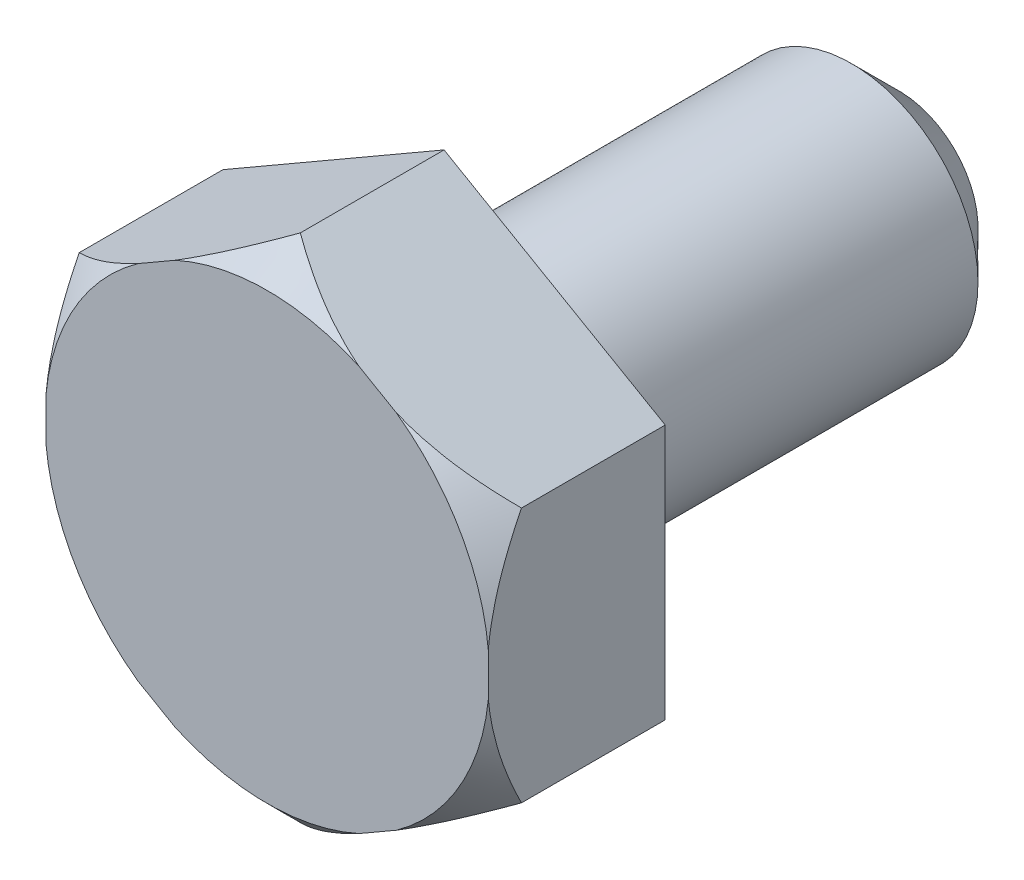
ISO-10303-21;
HEADER;
FILE_DESCRIPTION(('STEP AP214'),'2;1');
FILE_NAME('part.step','',(''),(''),'','','');
FILE_SCHEMA(('AUTOMOTIVE_DESIGN { 1 0 10303 214 1 1 1 1 }'));
ENDSEC;
DATA;
#1=APPLICATION_CONTEXT('core data for automotive mechanical design processes');
#2=APPLICATION_PROTOCOL_DEFINITION('international standard','automotive_design',2000,#1);
#3=PRODUCT_CONTEXT('',#1,'mechanical');
#4=PRODUCT('Part','Part','',(#3));
#5=PRODUCT_RELATED_PRODUCT_CATEGORY('part','',(#4));
#6=PRODUCT_DEFINITION_FORMATION('','',#4);
#7=PRODUCT_DEFINITION_CONTEXT('part definition',#1,'design');
#8=PRODUCT_DEFINITION('design','',#6,#7);
#9=PRODUCT_DEFINITION_SHAPE('','',#8);
#10=(LENGTH_UNIT() NAMED_UNIT(*) SI_UNIT(.MILLI.,.METRE.));
#11=(NAMED_UNIT(*) PLANE_ANGLE_UNIT() SI_UNIT($,.RADIAN.));
#12=(NAMED_UNIT(*) SI_UNIT($,.STERADIAN.) SOLID_ANGLE_UNIT());
#13=UNCERTAINTY_MEASURE_WITH_UNIT(LENGTH_MEASURE(1.E-05),#10,'distance_accuracy_value','');
#14=(GEOMETRIC_REPRESENTATION_CONTEXT(3) GLOBAL_UNCERTAINTY_ASSIGNED_CONTEXT((#13)) GLOBAL_UNIT_ASSIGNED_CONTEXT((#10,
#11,#12)) REPRESENTATION_CONTEXT('',''));
#15=CARTESIAN_POINT('',(0.,0.,0.));
#16=DIRECTION('',(0.,0.,1.));
#17=DIRECTION('',(1.,0.,0.));
#18=AXIS2_PLACEMENT_3D('',#15,#16,#17);
#19=CARTESIAN_POINT('',(3.5,2.02072594216369,2.8));
#20=DIRECTION('',(-0.5,-0.866025403784439,0.));
#21=DIRECTION('',(0.866025403784439,-0.5,0.));
#22=AXIS2_PLACEMENT_3D('',#19,#20,#21);
#23=PLANE('',#22);
#24=CARTESIAN_POINT('',(5.9454453864592,0.608847390002945,0.339913087692459));
#25=CARTESIAN_POINT('',(5.86253355712437,0.656716556988413,0.417507902960893));
#26=CARTESIAN_POINT('',(5.77929317667569,0.704775413047905,0.494638864110166));
#27=CARTESIAN_POINT('',(5.61204157732736,0.801338168954062,0.647795567213771));
#28=CARTESIAN_POINT('',(5.52803028979062,0.849842108428362,0.723821209168573));
#29=CARTESIAN_POINT('',(5.35893878090904,0.947467136598823,0.874753577786142));
#30=CARTESIAN_POINT('',(5.27385650528265,0.996589411334988,0.949657241459688));
#31=CARTESIAN_POINT('',(5.10268934375333,1.09541281812036,1.09791813904846));
#32=CARTESIAN_POINT('',(5.01660448486452,1.14511393457297,1.17127541448137));
#33=CARTESIAN_POINT('',(4.8408874884927,1.24656418972943,1.31814431061563));
#34=CARTESIAN_POINT('',(4.75122298625936,1.2983320142306,1.39160442675106));
#35=CARTESIAN_POINT('',(4.57047965672409,1.40268422419202,1.53616519114766));
#36=CARTESIAN_POINT('',(4.47940088323365,1.45526857858419,1.60726592885927));
#37=CARTESIAN_POINT('',(4.29567630148132,1.56134201531565,1.74652586332209));
#38=CARTESIAN_POINT('',(4.20303188550136,1.61483029382059,1.81468749999745));
#39=CARTESIAN_POINT('',(4.01585530132248,1.72289674508226,1.94744807331912));
#40=CARTESIAN_POINT('',(3.92132337276294,1.77747477948313,2.01204745836192));
#41=CARTESIAN_POINT('',(3.72756834413303,1.88933929741945,2.13845900293608));
#42=CARTESIAN_POINT('',(3.6282872421778,1.94665926835874,2.2001534177239));
#43=CARTESIAN_POINT('',(3.42711221948829,2.06280772186276,2.3176725874829));
#44=CARTESIAN_POINT('',(3.32521792819775,2.12163641836824,2.37349650421528));
#45=CARTESIAN_POINT('',(3.11914858474324,2.24061060928343,2.47743717172208));
#46=CARTESIAN_POINT('',(3.01498881650609,2.30074727951388,2.52559390618238));
#47=CARTESIAN_POINT('',(2.80380698340774,2.42267316770117,2.61270611917105));
#48=CARTESIAN_POINT('',(2.69678579554812,2.48446187932091,2.65166438176945));
#49=CARTESIAN_POINT('',(2.50137060521279,2.59728489206476,2.7118226004194));
#50=CARTESIAN_POINT('',(2.41343726761734,2.64805322819623,2.73500659242414));
#51=CARTESIAN_POINT('',(2.23623185162629,2.75036282282053,2.77312919578989));
#52=CARTESIAN_POINT('',(2.14695996966461,2.80190396790217,2.78806900506808));
#53=CARTESIAN_POINT('',(1.96777845837467,2.90535446167922,2.80893602489146));
#54=CARTESIAN_POINT('',(1.87787024257386,2.95726299427418,2.81487918820381));
#55=CARTESIAN_POINT('',(1.69795041756462,3.06113975367581,2.81747709971623));
#56=CARTESIAN_POINT('',(1.6079388073351,3.11310798107202,2.81413175538349));
#57=CARTESIAN_POINT('',(1.4287608471379,3.21655642462471,2.79835918825703));
#58=CARTESIAN_POINT('',(1.33959290258016,3.26803756141821,2.78595573147838));
#59=CARTESIAN_POINT('',(1.16243690874153,3.3703186221495,2.75273025141026));
#60=CARTESIAN_POINT('',(1.07444914417603,3.42111838170679,2.73190623312342));
#61=CARTESIAN_POINT('',(0.899817031987229,3.52194227868814,2.68270008111317));
#62=CARTESIAN_POINT('',(0.813177424181728,3.57196367957713,2.6542957881744));
#63=CARTESIAN_POINT('',(0.641717245262521,3.67095626003144,2.59100974097743));
#64=CARTESIAN_POINT('',(0.556896589382002,3.7199274885369,2.55612828930277));
#65=CARTESIAN_POINT('',(0.359385719898484,3.83396044220108,2.46758436700233));
#66=CARTESIAN_POINT('',(0.247463881106022,3.89857854595611,2.4116455046732));
#67=CARTESIAN_POINT('',(0.0267799028337228,4.02599050021746,2.2919452918341));
#68=CARTESIAN_POINT('',(-0.081980529611628,4.08878336516696,2.22817980885716));
#69=CARTESIAN_POINT('',(-0.296873342818029,4.21285178871859,2.09444860650389));
#70=CARTESIAN_POINT('',(-0.402999800696974,4.27412392774314,2.02447029350188));
#71=CARTESIAN_POINT('',(-0.612760035829428,4.39522905596214,1.87977669426378));
#72=CARTESIAN_POINT('',(-0.716394246490776,4.45506229538473,1.80506223999207));
#73=CARTESIAN_POINT('',(-0.92203200338347,4.57378730968228,1.65153695750505));
#74=CARTESIAN_POINT('',(-1.02402579514843,4.63267345281345,1.57270878721689));
#75=CARTESIAN_POINT('',(-1.22621704715098,4.7494086265849,1.41203158125712));
#76=CARTESIAN_POINT('',(-1.32641435655378,4.80725757014069,1.33018229367729));
#77=CARTESIAN_POINT('',(-1.62451526984676,4.97936621267606,1.08119553551893));
#78=CARTESIAN_POINT('',(-1.82015662470169,5.09231980156618,0.910444515892401));
#79=CARTESIAN_POINT('',(-2.08630228986086,5.24597907298948,0.671078723283172));
#80=CARTESIAN_POINT('',(-2.15870272344146,5.28777948280668,0.605227857205958));
#81=CARTESIAN_POINT('',(-2.30263042333883,5.37087617908628,0.473004386203389));
#82=CARTESIAN_POINT('',(-2.37416012123807,5.41217386942346,0.406635311835265));
#83=CARTESIAN_POINT('',(-2.4454453864592,5.45333043648813,0.339913087692462));
#84=B_SPLINE_CURVE_WITH_KNOTS('',3,(#24,#25,#26,#27,#28,#29,#30,#31,#32,#33,#34,#35,#36,#37,#38,
#39,#40,#41,#42,#43,#44,#45,#46,#47,#48,#49,#50,#51,#52,#53,#54,#55,#56,#57,#58,#59,#60,#61,#62,
#63,#64,#65,#66,#67,#68,#69,#70,#71,#72,#73,#74,#75,#76,#77,#78,#79,#80,#81,#82,#83),
.UNSPECIFIED.,.F.,.F.,(4,2,2,2,2,2,2,2,2,2,2,2,2,2,2,2,2,2,2,2,2,2,2,2,2,2,2,2,2,4),(0.,
0.3697065164903,0.739446275196128,1.11005834868063,1.48066045920368,1.86148013092087,
2.24228534819872,2.62276809806816,3.00320284503721,3.39362813267329,3.78410909301732,
4.17248185108359,4.56073691057943,4.87288952996369,5.18499678020368,5.49654995388696,
5.80810623129737,6.11884799356529,6.42966341987057,6.74139759086865,7.05311720271868,
7.47523215545123,7.89757095207291,8.32078629277429,8.74392749515359,9.16902504618888,
9.59415812333966,10.4434751115574,10.762737361846,11.0806064703738),.UNSPECIFIED.);
#85=CARTESIAN_POINT('',(3.5,2.02072594216369,2.275));
#86=VERTEX_POINT('',#85);
#87=CARTESIAN_POINT('',(2.04423696418394,2.8612111227684,2.8));
#88=VERTEX_POINT('',#87);
#89=EDGE_CURVE('E120',#86,#88,#84,.T.);
#90=ORIENTED_EDGE('',*,*,#89,.F.);
#91=DIRECTION('',(0.,0.,-1.));
#92=VECTOR('',#91,1.);
#93=CARTESIAN_POINT('',(3.5,2.02072594216369,2.8));
#94=LINE('',#93,#92);
#95=CARTESIAN_POINT('',(3.5,2.02072594216369,0.));
#96=VERTEX_POINT('',#95);
#97=EDGE_CURVE('E131',#86,#96,#94,.T.);
#98=ORIENTED_EDGE('',*,*,#97,.T.);
#99=DIRECTION('',(-0.866025403784439,0.5,0.));
#100=VECTOR('',#99,1.);
#101=CARTESIAN_POINT('',(3.5,2.02072594216369,0.));
#102=LINE('',#101,#100);
#103=CARTESIAN_POINT('',(0.,4.04145188432738,0.));
#104=VERTEX_POINT('',#103);
#105=EDGE_CURVE('E211',#96,#104,#102,.T.);
#106=ORIENTED_EDGE('',*,*,#105,.T.);
#107=DIRECTION('',(0.,0.,-1.));
#108=VECTOR('',#107,1.);
#109=CARTESIAN_POINT('',(0.,4.04145188432738,2.8));
#110=LINE('',#109,#108);
#111=CARTESIAN_POINT('',(0.,4.04145188432738,2.275));
#112=VERTEX_POINT('',#111);
#113=EDGE_CURVE('E156',#112,#104,#110,.T.);
#114=ORIENTED_EDGE('',*,*,#113,.F.);
#115=CARTESIAN_POINT('',(1.45576303581606,3.20096670372267,2.8));
#116=VERTEX_POINT('',#115);
#117=EDGE_CURVE('E137',#116,#112,#84,.T.);
#118=ORIENTED_EDGE('',*,*,#117,.F.);
#119=DIRECTION('',(-0.866025403784439,0.5,0.));
#120=VECTOR('',#119,1.);
#121=CARTESIAN_POINT('',(3.5,2.02072594216369,2.8));
#122=LINE('',#121,#120);
#123=EDGE_CURVE('E135',#88,#116,#122,.T.);
#124=ORIENTED_EDGE('',*,*,#123,.F.);
#125=EDGE_LOOP('',(#90,#98,#106,#114,#118,#124));
#126=FACE_BOUND('',#125,.T.);
#127=ADVANCED_FACE('F29',(#126),#23,.F.);
#128=CARTESIAN_POINT('',(0.,4.04145188432738,2.8));
#129=DIRECTION('',(0.5,-0.866025403784438,0.));
#130=DIRECTION('',(0.866025403784439,0.5,0.));
#131=AXIS2_PLACEMENT_3D('',#128,#129,#130);
#132=PLANE('',#131);
#133=CARTESIAN_POINT('',(2.4454453864592,5.45333043648813,0.339913087692458));
#134=CARTESIAN_POINT('',(2.36253355712437,5.40546126950266,0.417507902960892));
#135=CARTESIAN_POINT('',(2.27929317667569,5.35740241344317,0.494638864110165));
#136=CARTESIAN_POINT('',(2.11204157732736,5.26083965753701,0.64779556721377));
#137=CARTESIAN_POINT('',(2.02803028979062,5.21233571806271,0.723821209168572));
#138=CARTESIAN_POINT('',(1.85893878090904,5.11471068989225,0.874753577786141));
#139=CARTESIAN_POINT('',(1.77385650528265,5.06558841515609,0.949657241459687));
#140=CARTESIAN_POINT('',(1.60268934375333,4.96676500837071,1.09791813904846));
#141=CARTESIAN_POINT('',(1.51660448486452,4.91706389191811,1.17127541448137));
#142=CARTESIAN_POINT('',(1.34088748849271,4.81561363676165,1.31814431061563));
#143=CARTESIAN_POINT('',(1.25122298625936,4.76384581226047,1.39160442675106));
#144=CARTESIAN_POINT('',(1.07047965672409,4.65949360229906,1.53616519114766));
#145=CARTESIAN_POINT('',(0.979400883233651,4.60690924790689,1.60726592885927));
#146=CARTESIAN_POINT('',(0.79567630148132,4.50083581117543,1.74652586332208));
#147=CARTESIAN_POINT('',(0.703031885501364,4.44734753267048,1.81468749999745));
#148=CARTESIAN_POINT('',(0.515855301322478,4.33928108140881,1.94744807331912));
#149=CARTESIAN_POINT('',(0.421323372762938,4.28470304700794,2.01204745836192));
#150=CARTESIAN_POINT('',(0.227568344133031,4.17283852907162,2.13845900293608));
#151=CARTESIAN_POINT('',(0.1282872421778,4.11551855813233,2.2001534177239));
#152=CARTESIAN_POINT('',(-0.0728877805117049,3.99937010462831,2.3176725874829));
#153=CARTESIAN_POINT('',(-0.17478207180225,3.94054140812283,2.37349650421528));
#154=CARTESIAN_POINT('',(-0.380851415256754,3.82156721720764,2.47743717172208));
#155=CARTESIAN_POINT('',(-0.485011183493912,3.76143054697719,2.52559390618238));
#156=CARTESIAN_POINT('',(-0.696193016592258,3.6395046587899,2.61270611917105));
#157=CARTESIAN_POINT('',(-0.803214204451875,3.57771594717016,2.65166438176945));
#158=CARTESIAN_POINT('',(-0.998629394787207,3.46489293442631,2.7118226004194));
#159=CARTESIAN_POINT('',(-1.08656273238265,3.41412459829484,2.73500659242414));
#160=CARTESIAN_POINT('',(-1.26376814837371,3.31181500367055,2.77312919578989));
#161=CARTESIAN_POINT('',(-1.35304003033539,3.2602738585889,2.78806900506808));
#162=CARTESIAN_POINT('',(-1.53222154162532,3.15682336481186,2.80893602489146));
#163=CARTESIAN_POINT('',(-1.62212975742614,3.1049148322169,2.81487918820381));
#164=CARTESIAN_POINT('',(-1.80204958243538,3.00103807281526,2.81747709971623));
#165=CARTESIAN_POINT('',(-1.8920611926649,2.94906984541906,2.81413175538349));
#166=CARTESIAN_POINT('',(-2.07123915286209,2.84562140186636,2.79835918825703));
#167=CARTESIAN_POINT('',(-2.16040709741983,2.79414026507286,2.78595573147838));
#168=CARTESIAN_POINT('',(-2.33756309125846,2.69185920434157,2.75273025141026));
#169=CARTESIAN_POINT('',(-2.42555085582397,2.64105944478429,2.73190623312343));
#170=CARTESIAN_POINT('',(-2.60018296801277,2.54023554780293,2.68270008111317));
#171=CARTESIAN_POINT('',(-2.68682257581827,2.49021414691394,2.6542957881744));
#172=CARTESIAN_POINT('',(-2.85828275473747,2.39122156645963,2.59100974097743));
#173=CARTESIAN_POINT('',(-2.94310341061799,2.34225033795417,2.55612828930277));
#174=CARTESIAN_POINT('',(-3.14061428010151,2.22821738428999,2.46758436700233));
#175=CARTESIAN_POINT('',(-3.25253611889397,2.16359928053496,2.4116455046732));
#176=CARTESIAN_POINT('',(-3.47322009716627,2.03618732627361,2.2919452918341));
#177=CARTESIAN_POINT('',(-3.58198052961162,1.97339446132411,2.22817980885716));
#178=CARTESIAN_POINT('',(-3.79687334281802,1.84932603777248,2.0944486065039));
#179=CARTESIAN_POINT('',(-3.90299980069697,1.78805389874793,2.02447029350189));
#180=CARTESIAN_POINT('',(-4.11276003582942,1.66694877052893,1.87977669426379));
#181=CARTESIAN_POINT('',(-4.21639424649077,1.60711553110634,1.80506223999208));
#182=CARTESIAN_POINT('',(-4.42203200338346,1.4883905168088,1.65153695750506));
#183=CARTESIAN_POINT('',(-4.52402579514842,1.42950437367763,1.5727087872169));
#184=CARTESIAN_POINT('',(-4.72621704715097,1.31276919990617,1.41203158125713));
#185=CARTESIAN_POINT('',(-4.82641435655376,1.25492025635039,1.33018229367729));
#186=CARTESIAN_POINT('',(-5.12451526984674,1.08281161381501,1.08119553551894));
#187=CARTESIAN_POINT('',(-5.32015662470167,0.969858024924896,0.910444515892411));
#188=CARTESIAN_POINT('',(-5.58630228986085,0.816198753501595,0.67107872328318));
#189=CARTESIAN_POINT('',(-5.65870272344145,0.774398343684389,0.605227857205965));
#190=CARTESIAN_POINT('',(-5.80263042333883,0.691301647404793,0.473004386203391));
#191=CARTESIAN_POINT('',(-5.87416012123807,0.650003957067614,0.406635311835265));
#192=CARTESIAN_POINT('',(-5.9454453864592,0.60884739000294,0.339913087692459));
#193=B_SPLINE_CURVE_WITH_KNOTS('',3,(#133,#134,#135,#136,#137,#138,#139,#140,#141,#142,#143,
#144,#145,#146,#147,#148,#149,#150,#151,#152,#153,#154,#155,#156,#157,#158,#159,#160,#161,#162,
#163,#164,#165,#166,#167,#168,#169,#170,#171,#172,#173,#174,#175,#176,#177,#178,#179,#180,#181,
#182,#183,#184,#185,#186,#187,#188,#189,#190,#191,#192),.UNSPECIFIED.,.F.,.F.,(4,2,2,2,2,2,2,2,
2,2,2,2,2,2,2,2,2,2,2,2,2,2,2,2,2,2,2,2,2,4),(0.,0.3697065164903,0.739446275196129,
1.11005834868063,1.48066045920368,1.86148013092087,2.24228534819872,2.62276809806816,
3.00320284503721,3.39362813267329,3.78410909301732,4.17248185108359,4.56073691057943,
4.87288952996369,5.18499678020368,5.49654995388696,5.80810623129737,6.11884799356529,
6.42966341987057,6.74139759086865,7.05311720271867,7.47523215545123,7.8975709520729,
8.32078629277428,8.74392749515358,9.16902504618886,9.59415812333964,10.4434751115574,
10.762737361846,11.0806064703738),.UNSPECIFIED.);
#194=CARTESIAN_POINT('',(-1.45576303581606,3.20096670372267,2.8));
#195=VERTEX_POINT('',#194);
#196=EDGE_CURVE('E222',#112,#195,#193,.T.);
#197=ORIENTED_EDGE('',*,*,#196,.F.);
#198=ORIENTED_EDGE('',*,*,#113,.T.);
#199=DIRECTION('',(-0.866025403784439,-0.5,0.));
#200=VECTOR('',#199,1.);
#201=CARTESIAN_POINT('',(0.,4.04145188432738,0.));
#202=LINE('',#201,#200);
#203=CARTESIAN_POINT('',(-3.5,2.02072594216369,0.));
#204=VERTEX_POINT('',#203);
#205=EDGE_CURVE('E208',#104,#204,#202,.T.);
#206=ORIENTED_EDGE('',*,*,#205,.T.);
#207=DIRECTION('',(0.,0.,-1.));
#208=VECTOR('',#207,1.);
#209=CARTESIAN_POINT('',(-3.5,2.02072594216369,2.8));
#210=LINE('',#209,#208);
#211=CARTESIAN_POINT('',(-3.5,2.02072594216369,2.275));
#212=VERTEX_POINT('',#211);
#213=EDGE_CURVE('E154',#212,#204,#210,.T.);
#214=ORIENTED_EDGE('',*,*,#213,.F.);
#215=CARTESIAN_POINT('',(-2.04423696418395,2.8612111227684,2.8));
#216=VERTEX_POINT('',#215);
#217=EDGE_CURVE('E216',#216,#212,#193,.T.);
#218=ORIENTED_EDGE('',*,*,#217,.F.);
#219=DIRECTION('',(-0.866025403784439,-0.5,0.));
#220=VECTOR('',#219,1.);
#221=CARTESIAN_POINT('',(0.,4.04145188432738,2.8));
#222=LINE('',#221,#220);
#223=EDGE_CURVE('E193',#195,#216,#222,.T.);
#224=ORIENTED_EDGE('',*,*,#223,.F.);
#225=EDGE_LOOP('',(#197,#198,#206,#214,#218,#224));
#226=FACE_BOUND('',#225,.T.);
#227=ADVANCED_FACE('F229',(#226),#132,.F.);
#228=CARTESIAN_POINT('',(-3.5,2.02072594216369,2.8));
#229=DIRECTION('',(1.,0.,0.));
#230=DIRECTION('',(0.,1.,0.));
#231=AXIS2_PLACEMENT_3D('',#228,#229,#230);
#232=PLANE('',#231);
#233=CARTESIAN_POINT('',(-3.5,4.46617132862289,0.64223948641583));
#234=CARTESIAN_POINT('',(-3.5,4.36615164736515,0.720951029502494));
#235=CARTESIAN_POINT('',(-3.5,4.2656523011547,0.799060848155172));
#236=CARTESIAN_POINT('',(-3.5,4.06350911516997,0.953818569450278));
#237=CARTESIAN_POINT('',(-3.5,3.96186509070294,1.03046623064067));
#238=CARTESIAN_POINT('',(-3.5,3.75676531618448,1.18239649558527));
#239=CARTESIAN_POINT('',(-3.5,3.65330302346024,1.25767029011364));
#240=CARTESIAN_POINT('',(-3.5,3.44486261732433,1.40608329092323));
#241=CARTESIAN_POINT('',(-3.5,3.3398845764314,1.47922259882331));
#242=CARTESIAN_POINT('',(-3.5,3.12292977712561,1.62645942016656));
#243=CARTESIAN_POINT('',(-3.5,3.01086355785965,1.70042561263588));
#244=CARTESIAN_POINT('',(-3.5,2.78446626080894,1.84480256176793));
#245=CARTESIAN_POINT('',(-3.5,2.67013537175955,1.91521361299134));
#246=CARTESIAN_POINT('',(-3.5,2.43904748133273,2.05144821327695));
#247=CARTESIAN_POINT('',(-3.5,2.32229545716053,2.11728015617568));
#248=CARTESIAN_POINT('',(-3.5,2.08579865870973,2.24330267257561));
#249=CARTESIAN_POINT('',(-3.5,1.9660547033625,2.30349476880894));
#250=CARTESIAN_POINT('',(-3.5,1.73574528867696,2.41087387042537));
#251=CARTESIAN_POINT('',(-3.5,1.62550913652965,2.45876198639697));
#252=CARTESIAN_POINT('',(-3.5,1.40216698774427,2.54742409341151));
#253=CARTESIAN_POINT('',(-3.5,1.28906071735407,2.5881974029));
#254=CARTESIAN_POINT('',(-3.5,1.06134342629083,2.66064258813516));
#255=CARTESIAN_POINT('',(-3.5,0.946763975387203,2.69241235236031));
#256=CARTESIAN_POINT('',(-3.5,0.715288702967828,2.74588099661256));
#257=CARTESIAN_POINT('',(-3.5,0.598393830459294,2.76758391712195));
#258=CARTESIAN_POINT('',(-3.5,0.360811218055822,2.79990619113003));
#259=CARTESIAN_POINT('',(-3.5,0.240093473808948,2.81030977608788));
#260=CARTESIAN_POINT('',(-3.5,-0.00176744003654037,2.81853807492841));
#261=CARTESIAN_POINT('',(-3.5,-0.122910570349535,2.8163639213744));
#262=CARTESIAN_POINT('',(-3.5,-0.364679546532771,2.79957868558711));
#263=CARTESIAN_POINT('',(-3.5,-0.485302760012813,2.7849304095852));
#264=CARTESIAN_POINT('',(-3.5,-0.724587806133191,2.74418316164014));
#265=CARTESIAN_POINT('',(-3.5,-0.843249103512599,2.71808111661293));
#266=CARTESIAN_POINT('',(-3.5,-1.11390792048123,2.64644901846366));
#267=CARTESIAN_POINT('',(-3.5,-1.26497069616642,2.59741593251435));
#268=CARTESIAN_POINT('',(-3.5,-1.56212553903892,2.48615190116788));
#269=CARTESIAN_POINT('',(-3.5,-1.70821458004199,2.42391308180165));
#270=CARTESIAN_POINT('',(-3.5,-1.99672358687497,2.28898021036817));
#271=CARTESIAN_POINT('',(-3.5,-2.13910879537491,2.21621284279786));
#272=CARTESIAN_POINT('',(-3.5,-2.41965740364949,2.06310790710768));
#273=CARTESIAN_POINT('',(-3.5,-2.55782177238947,1.98277209401193));
#274=CARTESIAN_POINT('',(-3.5,-2.85064591374956,1.80415701279121));
#275=CARTESIAN_POINT('',(-3.5,-3.00475109749178,1.70497458255479));
#276=CARTESIAN_POINT('',(-3.5,-3.30924129237491,1.50102620172561));
#277=CARTESIAN_POINT('',(-3.5,-3.45962545717638,1.39625899767092));
#278=CARTESIAN_POINT('',(-3.5,-3.75404044412973,1.18492989881657));
#279=CARTESIAN_POINT('',(-3.5,-3.89813813273462,1.07846063101176));
#280=CARTESIAN_POINT('',(-3.5,-4.18385611631383,0.86245404396862));
#281=CARTESIAN_POINT('',(-3.5,-4.32547812782314,0.752918999584933));
#282=CARTESIAN_POINT('',(-3.5,-4.46617132862289,0.64223948641583));
#283=B_SPLINE_CURVE_WITH_KNOTS('',3,(#233,#234,#235,#236,#237,#238,#239,#240,#241,#242,#243,
#244,#245,#246,#247,#248,#249,#250,#251,#252,#253,#254,#255,#256,#257,#258,#259,#260,#261,#262,
#263,#264,#265,#266,#267,#268,#269,#270,#271,#272,#273,#274,#275,#276,#277,#278,#279,#280,#281,
#282),.UNSPECIFIED.,.F.,.F.,(4,2,2,2,2,2,2,2,2,2,2,2,2,2,2,2,2,2,2,2,2,2,2,2,4),(0.,
0.381835945563863,0.763734408767954,1.14755448843073,1.53135626523908,1.93412826130602,
2.33686683081283,2.73884655667604,3.14071743525492,3.50108354373295,3.86148415412643,
4.21780128196922,4.57397527244847,4.93683715631749,5.29966636677289,5.66358121891636,
6.02759377037452,6.50322221967221,6.97913506522801,7.45853748257543,7.9378290050842,
8.48745341037109,9.03720169855982,9.57464766690963,10.1117048952086),.UNSPECIFIED.);
#284=CARTESIAN_POINT('',(-3.5,0.339755580954275,2.8));
#285=VERTEX_POINT('',#284);
#286=EDGE_CURVE('E223',#212,#285,#283,.T.);
#287=ORIENTED_EDGE('',*,*,#286,.F.);
#288=ORIENTED_EDGE('',*,*,#213,.T.);
#289=DIRECTION('',(0.,-1.,0.));
#290=VECTOR('',#289,1.);
#291=CARTESIAN_POINT('',(-3.5,2.02072594216369,0.));
#292=LINE('',#291,#290);
#293=CARTESIAN_POINT('',(-3.5,-2.02072594216369,0.));
#294=VERTEX_POINT('',#293);
#295=EDGE_CURVE('E205',#204,#294,#292,.T.);
#296=ORIENTED_EDGE('',*,*,#295,.T.);
#297=DIRECTION('',(0.,0.,-1.));
#298=VECTOR('',#297,1.);
#299=CARTESIAN_POINT('',(-3.5,-2.02072594216369,2.8));
#300=LINE('',#299,#298);
#301=CARTESIAN_POINT('',(-3.5,-2.02072594216369,2.275));
#302=VERTEX_POINT('',#301);
#303=EDGE_CURVE('E152',#302,#294,#300,.T.);
#304=ORIENTED_EDGE('',*,*,#303,.F.);
#305=CARTESIAN_POINT('',(-3.5,-0.339755580954278,2.8));
#306=VERTEX_POINT('',#305);
#307=EDGE_CURVE('E224',#306,#302,#283,.T.);
#308=ORIENTED_EDGE('',*,*,#307,.F.);
#309=DIRECTION('',(0.,-1.,0.));
#310=VECTOR('',#309,1.);
#311=CARTESIAN_POINT('',(-3.5,2.02072594216369,2.8));
#312=LINE('',#311,#310);
#313=EDGE_CURVE('E191',#285,#306,#312,.T.);
#314=ORIENTED_EDGE('',*,*,#313,.F.);
#315=EDGE_LOOP('',(#287,#288,#296,#304,#308,#314));
#316=FACE_BOUND('',#315,.T.);
#317=ADVANCED_FACE('F266',(#316),#232,.F.);
#318=CARTESIAN_POINT('',(-3.5,-2.02072594216369,2.8));
#319=DIRECTION('',(0.5,0.866025403784439,0.));
#320=DIRECTION('',(-0.866025403784439,0.5,0.));
#321=AXIS2_PLACEMENT_3D('',#318,#319,#320);
#322=PLANE('',#321);
#323=CARTESIAN_POINT('',(-5.9454453864592,-0.608847390002946,0.339913087692461));
#324=CARTESIAN_POINT('',(-5.86253355712437,-0.656716556988414,0.417507902960895));
#325=CARTESIAN_POINT('',(-5.77929317667569,-0.704775413047906,0.494638864110168));
#326=CARTESIAN_POINT('',(-5.61204157732735,-0.801338168954063,0.647795567213773));
#327=CARTESIAN_POINT('',(-5.52803028979062,-0.849842108428363,0.723821209168575));
#328=CARTESIAN_POINT('',(-5.35893878090904,-0.947467136598825,0.874753577786143));
#329=CARTESIAN_POINT('',(-5.27385650528264,-0.996589411334989,0.949657241459689));
#330=CARTESIAN_POINT('',(-5.10268934375333,-1.09541281812036,1.09791813904846));
#331=CARTESIAN_POINT('',(-5.01660448486452,-1.14511393457297,1.17127541448137));
#332=CARTESIAN_POINT('',(-4.8408874884927,-1.24656418972943,1.31814431061563));
#333=CARTESIAN_POINT('',(-4.75122298625936,-1.2983320142306,1.39160442675106));
#334=CARTESIAN_POINT('',(-4.57047965672409,-1.40268422419202,1.53616519114767));
#335=CARTESIAN_POINT('',(-4.47940088323365,-1.45526857858419,1.60726592885927));
#336=CARTESIAN_POINT('',(-4.29567630148132,-1.56134201531565,1.74652586332209));
#337=CARTESIAN_POINT('',(-4.20303188550136,-1.61483029382059,1.81468749999745));
#338=CARTESIAN_POINT('',(-4.01585530132248,-1.72289674508227,1.94744807331912));
#339=CARTESIAN_POINT('',(-3.92132337276294,-1.77747477948313,2.01204745836192));
#340=CARTESIAN_POINT('',(-3.72756834413303,-1.88933929741945,2.13845900293608));
#341=CARTESIAN_POINT('',(-3.6282872421778,-1.94665926835875,2.2001534177239));
#342=CARTESIAN_POINT('',(-3.42711221948829,-2.06280772186276,2.3176725874829));
#343=CARTESIAN_POINT('',(-3.32521792819775,-2.12163641836824,2.37349650421528));
#344=CARTESIAN_POINT('',(-3.11914858474324,-2.24061060928343,2.47743717172208));
#345=CARTESIAN_POINT('',(-3.01498881650609,-2.30074727951388,2.52559390618238));
#346=CARTESIAN_POINT('',(-2.80380698340774,-2.42267316770117,2.61270611917105));
#347=CARTESIAN_POINT('',(-2.69678579554812,-2.48446187932091,2.65166438176945));
#348=CARTESIAN_POINT('',(-2.50137060521279,-2.59728489206476,2.7118226004194));
#349=CARTESIAN_POINT('',(-2.41343726761734,-2.64805322819623,2.73500659242414));
#350=CARTESIAN_POINT('',(-2.23623185162629,-2.75036282282053,2.77312919578989));
#351=CARTESIAN_POINT('',(-2.14695996966461,-2.80190396790217,2.78806900506808));
#352=CARTESIAN_POINT('',(-1.96777845837468,-2.90535446167922,2.80893602489145));
#353=CARTESIAN_POINT('',(-1.87787024257386,-2.95726299427418,2.81487918820381));
#354=CARTESIAN_POINT('',(-1.69795041756462,-3.06113975367581,2.81747709971623));
#355=CARTESIAN_POINT('',(-1.6079388073351,-3.11310798107202,2.81413175538349));
#356=CARTESIAN_POINT('',(-1.4287608471379,-3.21655642462471,2.79835918825703));
#357=CARTESIAN_POINT('',(-1.33959290258017,-3.26803756141821,2.78595573147838));
#358=CARTESIAN_POINT('',(-1.16243690874153,-3.3703186221495,2.75273025141026));
#359=CARTESIAN_POINT('',(-1.07444914417603,-3.42111838170679,2.73190623312342));
#360=CARTESIAN_POINT('',(-0.899817031987231,-3.52194227868814,2.68270008111317));
#361=CARTESIAN_POINT('',(-0.81317742418173,-3.57196367957713,2.6542957881744));
#362=CARTESIAN_POINT('',(-0.641717245262523,-3.67095626003144,2.59100974097743));
#363=CARTESIAN_POINT('',(-0.556896589382003,-3.7199274885369,2.55612828930277));
#364=CARTESIAN_POINT('',(-0.359385719898486,-3.83396044220108,2.46758436700233));
#365=CARTESIAN_POINT('',(-0.247463881106024,-3.89857854595611,2.4116455046732));
#366=CARTESIAN_POINT('',(-0.0267799028337256,-4.02599050021746,2.2919452918341));
#367=CARTESIAN_POINT('',(0.0819805296116251,-4.08878336516696,2.22817980885716));
#368=CARTESIAN_POINT('',(0.296873342818026,-4.21285178871859,2.09444860650389));
#369=CARTESIAN_POINT('',(0.40299980069697,-4.27412392774314,2.02447029350188));
#370=CARTESIAN_POINT('',(0.612760035829424,-4.39522905596214,1.87977669426379));
#371=CARTESIAN_POINT('',(0.716394246490773,-4.45506229538473,1.80506223999207));
#372=CARTESIAN_POINT('',(0.922032003383468,-4.57378730968228,1.65153695750505));
#373=CARTESIAN_POINT('',(1.02402579514843,-4.63267345281345,1.57270878721689));
#374=CARTESIAN_POINT('',(1.22621704715097,-4.7494086265849,1.41203158125712));
#375=CARTESIAN_POINT('',(1.32641435655377,-4.80725757014069,1.33018229367729));
#376=CARTESIAN_POINT('',(1.62451526984675,-4.97936621267606,1.08119553551894));
#377=CARTESIAN_POINT('',(1.82015662470168,-5.09231980156618,0.910444515892403));
#378=CARTESIAN_POINT('',(2.08630228986086,-5.24597907298948,0.671078723283173));
#379=CARTESIAN_POINT('',(2.15870272344146,-5.28777948280668,0.605227857205959));
#380=CARTESIAN_POINT('',(2.30263042333883,-5.37087617908628,0.473004386203389));
#381=CARTESIAN_POINT('',(2.37416012123807,-5.41217386942346,0.406635311835265));
#382=CARTESIAN_POINT('',(2.4454453864592,-5.45333043648813,0.339913087692461));
#383=B_SPLINE_CURVE_WITH_KNOTS('',3,(#323,#324,#325,#326,#327,#328,#329,#330,#331,#332,#333,
#334,#335,#336,#337,#338,#339,#340,#341,#342,#343,#344,#345,#346,#347,#348,#349,#350,#351,#352,
#353,#354,#355,#356,#357,#358,#359,#360,#361,#362,#363,#364,#365,#366,#367,#368,#369,#370,#371,
#372,#373,#374,#375,#376,#377,#378,#379,#380,#381,#382),.UNSPECIFIED.,.F.,.F.,(4,2,2,2,2,2,2,2,
2,2,2,2,2,2,2,2,2,2,2,2,2,2,2,2,2,2,2,2,2,4),(0.,0.369706516490301,0.739446275196129,
1.11005834868063,1.48066045920368,1.86148013092087,2.24228534819872,2.62276809806816,
3.00320284503721,3.39362813267329,3.78410909301731,4.17248185108358,4.56073691057942,
4.87288952996369,5.18499678020368,5.49654995388696,5.80810623129737,6.11884799356529,
6.42966341987057,6.74139759086865,7.05311720271867,7.47523215545123,7.8975709520729,
8.32078629277428,8.74392749515358,9.16902504618887,9.59415812333965,10.4434751115574,
10.762737361846,11.0806064703738),.UNSPECIFIED.);
#384=CARTESIAN_POINT('',(-2.04423696418394,-2.8612111227684,2.8));
#385=VERTEX_POINT('',#384);
#386=EDGE_CURVE('E186',#302,#385,#383,.T.);
#387=ORIENTED_EDGE('',*,*,#386,.F.);
#388=ORIENTED_EDGE('',*,*,#303,.T.);
#389=DIRECTION('',(0.866025403784439,-0.5,0.));
#390=VECTOR('',#389,1.);
#391=CARTESIAN_POINT('',(-3.5,-2.02072594216369,0.));
#392=LINE('',#391,#390);
#393=CARTESIAN_POINT('',(0.,-4.04145188432738,0.));
#394=VERTEX_POINT('',#393);
#395=EDGE_CURVE('E203',#294,#394,#392,.T.);
#396=ORIENTED_EDGE('',*,*,#395,.T.);
#397=DIRECTION('',(0.,0.,-1.));
#398=VECTOR('',#397,1.);
#399=CARTESIAN_POINT('',(0.,-4.04145188432738,2.8));
#400=LINE('',#399,#398);
#401=CARTESIAN_POINT('',(0.,-4.04145188432738,2.275));
#402=VERTEX_POINT('',#401);
#403=EDGE_CURVE('E145',#402,#394,#400,.T.);
#404=ORIENTED_EDGE('',*,*,#403,.F.);
#405=CARTESIAN_POINT('',(-1.45576303581606,-3.20096670372267,2.8));
#406=VERTEX_POINT('',#405);
#407=EDGE_CURVE('E174',#406,#402,#383,.T.);
#408=ORIENTED_EDGE('',*,*,#407,.F.);
#409=DIRECTION('',(0.866025403784439,-0.5,0.));
#410=VECTOR('',#409,1.);
#411=CARTESIAN_POINT('',(-3.5,-2.02072594216369,2.8));
#412=LINE('',#411,#410);
#413=EDGE_CURVE('E184',#385,#406,#412,.T.);
#414=ORIENTED_EDGE('',*,*,#413,.F.);
#415=EDGE_LOOP('',(#387,#388,#396,#404,#408,#414));
#416=FACE_BOUND('',#415,.T.);
#417=ADVANCED_FACE('F183',(#416),#322,.F.);
#418=CARTESIAN_POINT('',(0.,-4.04145188432738,2.8));
#419=DIRECTION('',(-0.5,0.866025403784439,0.));
#420=DIRECTION('',(-0.866025403784439,-0.5,0.));
#421=AXIS2_PLACEMENT_3D('',#418,#419,#420);
#422=PLANE('',#421);
#423=CARTESIAN_POINT('',(-2.4454453864592,-5.45333043648813,0.33991308769246));
#424=CARTESIAN_POINT('',(-2.36253355712437,-5.40546126950266,0.417507902960892));
#425=CARTESIAN_POINT('',(-2.27929317667569,-5.35740241344317,0.494638864110165));
#426=CARTESIAN_POINT('',(-2.11204157732735,-5.26083965753701,0.64779556721377));
#427=CARTESIAN_POINT('',(-2.02803028979062,-5.21233571806271,0.723821209168573));
#428=CARTESIAN_POINT('',(-1.85893878090904,-5.11471068989225,0.874753577786142));
#429=CARTESIAN_POINT('',(-1.77385650528264,-5.06558841515608,0.949657241459688));
#430=CARTESIAN_POINT('',(-1.60268934375333,-4.96676500837071,1.09791813904846));
#431=CARTESIAN_POINT('',(-1.51660448486452,-4.91706389191811,1.17127541448137));
#432=CARTESIAN_POINT('',(-1.3408874884927,-4.81561363676165,1.31814431061563));
#433=CARTESIAN_POINT('',(-1.25122298625936,-4.76384581226047,1.39160442675106));
#434=CARTESIAN_POINT('',(-1.07047965672409,-4.65949360229905,1.53616519114766));
#435=CARTESIAN_POINT('',(-0.979400883233649,-4.60690924790689,1.60726592885927));
#436=CARTESIAN_POINT('',(-0.795676301481318,-4.50083581117543,1.74652586332208));
#437=CARTESIAN_POINT('',(-0.703031885501362,-4.44734753267048,1.81468749999745));
#438=CARTESIAN_POINT('',(-0.515855301322476,-4.33928108140881,1.94744807331912));
#439=CARTESIAN_POINT('',(-0.421323372762936,-4.28470304700794,2.01204745836192));
#440=CARTESIAN_POINT('',(-0.227568344133029,-4.17283852907162,2.13845900293608));
#441=CARTESIAN_POINT('',(-0.128287242177798,-4.11551855813233,2.2001534177239));
#442=CARTESIAN_POINT('',(0.0728877805117065,-3.99937010462831,2.3176725874829));
#443=CARTESIAN_POINT('',(0.174782071802251,-3.94054140812283,2.37349650421528));
#444=CARTESIAN_POINT('',(0.380851415256755,-3.82156721720764,2.47743717172208));
#445=CARTESIAN_POINT('',(0.485011183493914,-3.76143054697719,2.52559390618238));
#446=CARTESIAN_POINT('',(0.696193016592259,-3.6395046587899,2.61270611917105));
#447=CARTESIAN_POINT('',(0.803214204451876,-3.57771594717016,2.65166438176945));
#448=CARTESIAN_POINT('',(0.998629394787208,-3.46489293442631,2.71182260041939));
#449=CARTESIAN_POINT('',(1.08656273238265,-3.41412459829484,2.73500659242414));
#450=CARTESIAN_POINT('',(1.26376814837371,-3.31181500367055,2.77312919578989));
#451=CARTESIAN_POINT('',(1.35304003033539,-3.2602738585889,2.78806900506808));
#452=CARTESIAN_POINT('',(1.53222154162532,-3.15682336481186,2.80893602489145));
#453=CARTESIAN_POINT('',(1.62212975742614,-3.1049148322169,2.81487918820381));
#454=CARTESIAN_POINT('',(1.80204958243538,-3.00103807281526,2.81747709971623));
#455=CARTESIAN_POINT('',(1.8920611926649,-2.94906984541906,2.81413175538349));
#456=CARTESIAN_POINT('',(2.07123915286209,-2.84562140186636,2.79835918825703));
#457=CARTESIAN_POINT('',(2.16040709741983,-2.79414026507286,2.78595573147838));
#458=CARTESIAN_POINT('',(2.33756309125847,-2.69185920434157,2.75273025141026));
#459=CARTESIAN_POINT('',(2.42555085582397,-2.64105944478429,2.73190623312342));
#460=CARTESIAN_POINT('',(2.60018296801277,-2.54023554780293,2.68270008111317));
#461=CARTESIAN_POINT('',(2.68682257581827,-2.49021414691394,2.6542957881744));
#462=CARTESIAN_POINT('',(2.85828275473748,-2.39122156645963,2.59100974097743));
#463=CARTESIAN_POINT('',(2.943103410618,-2.34225033795418,2.55612828930277));
#464=CARTESIAN_POINT('',(3.14061428010151,-2.22821738428999,2.46758436700233));
#465=CARTESIAN_POINT('',(3.25253611889398,-2.16359928053496,2.4116455046732));
#466=CARTESIAN_POINT('',(3.47322009716627,-2.03618732627362,2.2919452918341));
#467=CARTESIAN_POINT('',(3.58198052961162,-1.97339446132411,2.22817980885716));
#468=CARTESIAN_POINT('',(3.79687334281802,-1.84932603777248,2.09444860650389));
#469=CARTESIAN_POINT('',(3.90299980069697,-1.78805389874793,2.02447029350188));
#470=CARTESIAN_POINT('',(4.11276003582942,-1.66694877052893,1.87977669426379));
#471=CARTESIAN_POINT('',(4.21639424649077,-1.60711553110634,1.80506223999208));
#472=CARTESIAN_POINT('',(4.42203200338347,-1.4883905168088,1.65153695750505));
#473=CARTESIAN_POINT('',(4.52402579514843,-1.42950437367763,1.57270878721689));
#474=CARTESIAN_POINT('',(4.72621704715097,-1.31276919990617,1.41203158125713));
#475=CARTESIAN_POINT('',(4.82641435655377,-1.25492025635039,1.33018229367729));
#476=CARTESIAN_POINT('',(5.12451526984675,-1.08281161381501,1.08119553551894));
#477=CARTESIAN_POINT('',(5.32015662470168,-0.969858024924895,0.910444515892404));
#478=CARTESIAN_POINT('',(5.58630228986085,-0.816198753501594,0.671078723283175));
#479=CARTESIAN_POINT('',(5.65870272344146,-0.774398343684389,0.605227857205961));
#480=CARTESIAN_POINT('',(5.80263042333883,-0.691301647404795,0.473004386203389));
#481=CARTESIAN_POINT('',(5.87416012123807,-0.650003957067616,0.406635311835264));
#482=CARTESIAN_POINT('',(5.9454453864592,-0.608847390002942,0.33991308769246));
#483=B_SPLINE_CURVE_WITH_KNOTS('',3,(#423,#424,#425,#426,#427,#428,#429,#430,#431,#432,#433,
#434,#435,#436,#437,#438,#439,#440,#441,#442,#443,#444,#445,#446,#447,#448,#449,#450,#451,#452,
#453,#454,#455,#456,#457,#458,#459,#460,#461,#462,#463,#464,#465,#466,#467,#468,#469,#470,#471,
#472,#473,#474,#475,#476,#477,#478,#479,#480,#481,#482),.UNSPECIFIED.,.F.,.F.,(4,2,2,2,2,2,2,2,
2,2,2,2,2,2,2,2,2,2,2,2,2,2,2,2,2,2,2,2,2,4),(0.,0.369706516490301,0.739446275196129,
1.11005834868063,1.48066045920368,1.86148013092087,2.24228534819872,2.62276809806816,
3.00320284503721,3.39362813267329,3.78410909301732,4.17248185108359,4.56073691057942,
4.87288952996369,5.18499678020368,5.49654995388696,5.80810623129737,6.11884799356529,
6.42966341987057,6.74139759086865,7.05311720271868,7.47523215545123,7.8975709520729,
8.32078629277429,8.74392749515358,9.16902504618887,9.59415812333965,10.4434751115574,
10.762737361846,11.0806064703738),.UNSPECIFIED.);
#484=CARTESIAN_POINT('',(1.45576303581606,-3.20096670372267,2.8));
#485=VERTEX_POINT('',#484);
#486=EDGE_CURVE('E52',#402,#485,#483,.T.);
#487=ORIENTED_EDGE('',*,*,#486,.F.);
#488=ORIENTED_EDGE('',*,*,#403,.T.);
#489=DIRECTION('',(0.866025403784439,0.5,0.));
#490=VECTOR('',#489,1.);
#491=CARTESIAN_POINT('',(0.,-4.04145188432738,0.));
#492=LINE('',#491,#490);
#493=CARTESIAN_POINT('',(3.5,-2.02072594216369,0.));
#494=VERTEX_POINT('',#493);
#495=EDGE_CURVE('E200',#394,#494,#492,.T.);
#496=ORIENTED_EDGE('',*,*,#495,.T.);
#497=DIRECTION('',(0.,0.,-1.));
#498=VECTOR('',#497,1.);
#499=CARTESIAN_POINT('',(3.5,-2.02072594216369,2.8));
#500=LINE('',#499,#498);
#501=CARTESIAN_POINT('',(3.5,-2.02072594216369,2.275));
#502=VERTEX_POINT('',#501);
#503=EDGE_CURVE('E142',#502,#494,#500,.T.);
#504=ORIENTED_EDGE('',*,*,#503,.F.);
#505=CARTESIAN_POINT('',(2.04423696418394,-2.8612111227684,2.8));
#506=VERTEX_POINT('',#505);
#507=EDGE_CURVE('E254',#506,#502,#483,.T.);
#508=ORIENTED_EDGE('',*,*,#507,.F.);
#509=DIRECTION('',(0.866025403784439,0.5,0.));
#510=VECTOR('',#509,1.);
#511=CARTESIAN_POINT('',(0.,-4.04145188432738,2.8));
#512=LINE('',#511,#510);
#513=EDGE_CURVE('E147',#485,#506,#512,.T.);
#514=ORIENTED_EDGE('',*,*,#513,.F.);
#515=EDGE_LOOP('',(#487,#488,#496,#504,#508,#514));
#516=FACE_BOUND('',#515,.T.);
#517=ADVANCED_FACE('F265',(#516),#422,.F.);
#518=CARTESIAN_POINT('',(3.5,-2.02072594216369,2.8));
#519=DIRECTION('',(-1.,0.,0.));
#520=DIRECTION('',(0.,-1.,0.));
#521=AXIS2_PLACEMENT_3D('',#518,#519,#520);
#522=PLANE('',#521);
#523=CARTESIAN_POINT('',(3.5,-4.46617132862289,0.642239486415829));
#524=CARTESIAN_POINT('',(3.5,-4.36615164736515,0.720951029502492));
#525=CARTESIAN_POINT('',(3.5,-4.2656523011547,0.79906084815517));
#526=CARTESIAN_POINT('',(3.5,-4.06350911516997,0.953818569450277));
#527=CARTESIAN_POINT('',(3.5,-3.96186509070294,1.03046623064067));
#528=CARTESIAN_POINT('',(3.5,-3.75676531618448,1.18239649558527));
#529=CARTESIAN_POINT('',(3.5,-3.65330302346024,1.25767029011364));
#530=CARTESIAN_POINT('',(3.5,-3.44486261732433,1.40608329092323));
#531=CARTESIAN_POINT('',(3.5,-3.3398845764314,1.47922259882331));
#532=CARTESIAN_POINT('',(3.5,-3.12292977712561,1.62645942016656));
#533=CARTESIAN_POINT('',(3.5,-3.01086355785965,1.70042561263588));
#534=CARTESIAN_POINT('',(3.5,-2.78446626080895,1.84480256176793));
#535=CARTESIAN_POINT('',(3.5,-2.67013537175956,1.91521361299134));
#536=CARTESIAN_POINT('',(3.5,-2.43904748133273,2.05144821327694));
#537=CARTESIAN_POINT('',(3.5,-2.32229545716053,2.11728015617568));
#538=CARTESIAN_POINT('',(3.5,-2.08579865870974,2.24330267257561));
#539=CARTESIAN_POINT('',(3.5,-1.96605470336251,2.30349476880894));
#540=CARTESIAN_POINT('',(3.5,-1.73574528867696,2.41087387042537));
#541=CARTESIAN_POINT('',(3.5,-1.62550913652965,2.45876198639697));
#542=CARTESIAN_POINT('',(3.5,-1.40216698774427,2.54742409341151));
#543=CARTESIAN_POINT('',(3.5,-1.28906071735407,2.5881974029));
#544=CARTESIAN_POINT('',(3.5,-1.06134342629084,2.66064258813516));
#545=CARTESIAN_POINT('',(3.5,-0.946763975387207,2.69241235236031));
#546=CARTESIAN_POINT('',(3.5,-0.715288702967833,2.74588099661256));
#547=CARTESIAN_POINT('',(3.5,-0.598393830459298,2.76758391712195));
#548=CARTESIAN_POINT('',(3.5,-0.360811218055826,2.79990619113003));
#549=CARTESIAN_POINT('',(3.5,-0.240093473808953,2.81030977608788));
#550=CARTESIAN_POINT('',(3.5,0.001767440036535,2.81853807492841));
#551=CARTESIAN_POINT('',(3.5,0.122910570349529,2.8163639213744));
#552=CARTESIAN_POINT('',(3.5,0.364679546532766,2.79957868558711));
#553=CARTESIAN_POINT('',(3.5,0.485302760012808,2.7849304095852));
#554=CARTESIAN_POINT('',(3.5,0.724587806133185,2.74418316164014));
#555=CARTESIAN_POINT('',(3.5,0.843249103512594,2.71808111661293));
#556=CARTESIAN_POINT('',(3.5,1.11390792048123,2.64644901846367));
#557=CARTESIAN_POINT('',(3.5,1.26497069616642,2.59741593251435));
#558=CARTESIAN_POINT('',(3.5,1.56212553903892,2.48615190116788));
#559=CARTESIAN_POINT('',(3.5,1.70821458004198,2.42391308180166));
#560=CARTESIAN_POINT('',(3.5,1.99672358687497,2.28898021036818));
#561=CARTESIAN_POINT('',(3.5,2.1391087953749,2.21621284279787));
#562=CARTESIAN_POINT('',(3.5,2.41965740364948,2.06310790710769));
#563=CARTESIAN_POINT('',(3.5,2.55782177238946,1.98277209401193));
#564=CARTESIAN_POINT('',(3.5,2.85064591374955,1.80415701279121));
#565=CARTESIAN_POINT('',(3.5,3.00475109749178,1.70497458255479));
#566=CARTESIAN_POINT('',(3.5,3.3092412923749,1.50102620172561));
#567=CARTESIAN_POINT('',(3.5,3.45962545717637,1.39625899767092));
#568=CARTESIAN_POINT('',(3.5,3.75404044412973,1.18492989881657));
#569=CARTESIAN_POINT('',(3.5,3.89813813273461,1.07846063101176));
#570=CARTESIAN_POINT('',(3.5,4.18385611631383,0.862454043968621));
#571=CARTESIAN_POINT('',(3.5,4.32547812782313,0.752918999584934));
#572=CARTESIAN_POINT('',(3.5,4.46617132862289,0.64223948641583));
#573=B_SPLINE_CURVE_WITH_KNOTS('',3,(#523,#524,#525,#526,#527,#528,#529,#530,#531,#532,#533,
#534,#535,#536,#537,#538,#539,#540,#541,#542,#543,#544,#545,#546,#547,#548,#549,#550,#551,#552,
#553,#554,#555,#556,#557,#558,#559,#560,#561,#562,#563,#564,#565,#566,#567,#568,#569,#570,#571,
#572),.UNSPECIFIED.,.F.,.F.,(4,2,2,2,2,2,2,2,2,2,2,2,2,2,2,2,2,2,2,2,2,2,2,2,4),(0.,
0.381835945563863,0.763734408767954,1.14755448843073,1.53135626523908,1.93412826130602,
2.33686683081283,2.73884655667604,3.14071743525491,3.50108354373294,3.86148415412642,
4.21780128196922,4.57397527244847,4.93683715631749,5.29966636677289,5.66358121891635,
6.02759377037452,6.5032222196722,6.979135065228,7.45853748257542,7.93782900508419,
8.48745341037109,9.03720169855981,9.57464766690962,10.1117048952086),.UNSPECIFIED.);
#574=CARTESIAN_POINT('',(3.5,-0.339755580954265,2.8));
#575=VERTEX_POINT('',#574);
#576=EDGE_CURVE('E44',#502,#575,#573,.T.);
#577=ORIENTED_EDGE('',*,*,#576,.F.);
#578=ORIENTED_EDGE('',*,*,#503,.T.);
#579=DIRECTION('',(0.,1.,0.));
#580=VECTOR('',#579,1.);
#581=CARTESIAN_POINT('',(3.5,-2.02072594216369,0.));
#582=LINE('',#581,#580);
#583=EDGE_CURVE('E140',#494,#96,#582,.T.);
#584=ORIENTED_EDGE('',*,*,#583,.T.);
#585=ORIENTED_EDGE('',*,*,#97,.F.);
#586=CARTESIAN_POINT('',(3.5,0.339755580954267,2.8));
#587=VERTEX_POINT('',#586);
#588=EDGE_CURVE('E117',#587,#86,#573,.T.);
#589=ORIENTED_EDGE('',*,*,#588,.F.);
#590=DIRECTION('',(0.,1.,0.));
#591=VECTOR('',#590,1.);
#592=CARTESIAN_POINT('',(3.5,-2.02072594216369,2.8));
#593=LINE('',#592,#591);
#594=EDGE_CURVE('E143',#575,#587,#593,.T.);
#595=ORIENTED_EDGE('',*,*,#594,.F.);
#596=EDGE_LOOP('',(#577,#578,#584,#585,#589,#595));
#597=FACE_BOUND('',#596,.T.);
#598=ADVANCED_FACE('F138',(#597),#522,.F.);
#599=CARTESIAN_POINT('',(3.5,2.02072594216369,2.8));
#600=DIRECTION('',(0.,0.,-1.));
#601=DIRECTION('',(-1.,0.,0.));
#602=AXIS2_PLACEMENT_3D('',#599,#600,#601);
#603=PLANE('',#602);
#604=CARTESIAN_POINT('',(0.,0.,2.8));
#605=DIRECTION('',(0.,0.,-1.));
#606=DIRECTION('',(-1.,0.,0.));
#607=AXIS2_PLACEMENT_3D('',#604,#605,#606);
#608=CIRCLE('',#607,3.51645188432738);
#609=EDGE_CURVE('E160',#285,#216,#608,.T.);
#610=ORIENTED_EDGE('',*,*,#609,.F.);
#611=ORIENTED_EDGE('',*,*,#313,.T.);
#612=EDGE_CURVE('E158',#385,#306,#608,.T.);
#613=ORIENTED_EDGE('',*,*,#612,.F.);
#614=ORIENTED_EDGE('',*,*,#413,.T.);
#615=EDGE_CURVE('E159',#485,#406,#608,.T.);
#616=ORIENTED_EDGE('',*,*,#615,.F.);
#617=ORIENTED_EDGE('',*,*,#513,.T.);
#618=EDGE_CURVE('E168',#575,#506,#608,.T.);
#619=ORIENTED_EDGE('',*,*,#618,.F.);
#620=ORIENTED_EDGE('',*,*,#594,.T.);
#621=CARTESIAN_POINT('',(0.,0.,2.8));
#622=DIRECTION('',(0.,0.,1.));
#623=DIRECTION('',(1.,0.,0.));
#624=AXIS2_PLACEMENT_3D('',#621,#622,#623);
#625=CIRCLE('',#624,3.51645188432738);
#626=EDGE_CURVE('E122',#587,#88,#625,.T.);
#627=ORIENTED_EDGE('',*,*,#626,.T.);
#628=ORIENTED_EDGE('',*,*,#123,.T.);
#629=EDGE_CURVE('E164',#195,#116,#608,.T.);
#630=ORIENTED_EDGE('',*,*,#629,.F.);
#631=ORIENTED_EDGE('',*,*,#223,.T.);
#632=EDGE_LOOP('',(#610,#611,#613,#614,#616,#617,#619,#620,#627,#628,#630,#631));
#633=FACE_BOUND('',#632,.T.);
#634=ADVANCED_FACE('F189',(#633),#603,.F.);
#635=CARTESIAN_POINT('',(3.5,2.02072594216369,0.));
#636=DIRECTION('',(0.,0.,-1.));
#637=DIRECTION('',(-1.,0.,0.));
#638=AXIS2_PLACEMENT_3D('',#635,#636,#637);
#639=PLANE('',#638);
#640=ORIENTED_EDGE('',*,*,#105,.F.);
#641=ORIENTED_EDGE('',*,*,#583,.F.);
#642=ORIENTED_EDGE('',*,*,#495,.F.);
#643=ORIENTED_EDGE('',*,*,#395,.F.);
#644=ORIENTED_EDGE('',*,*,#295,.F.);
#645=ORIENTED_EDGE('',*,*,#205,.F.);
#646=EDGE_LOOP('',(#640,#641,#642,#643,#644,#645));
#647=FACE_BOUND('',#646,.T.);
#648=CARTESIAN_POINT('',(0.,0.,0.));
#649=DIRECTION('',(0.,0.,-1.));
#650=DIRECTION('',(-1.,0.,0.));
#651=AXIS2_PLACEMENT_3D('',#648,#649,#650);
#652=CIRCLE('',#651,2.);
#653=CARTESIAN_POINT('',(-2.,0.,0.));
#654=VERTEX_POINT('',#653);
#655=EDGE_CURVE('E213',#654,#654,#652,.T.);
#656=ORIENTED_EDGE('',*,*,#655,.F.);
#657=EDGE_LOOP('',(#656));
#658=FACE_BOUND('',#657,.T.);
#659=ADVANCED_FACE('F284',(#647,#658),#639,.T.);
#660=CARTESIAN_POINT('',(0.,0.,-7.2));
#661=DIRECTION('',(0.,0.,1.));
#662=DIRECTION('',(1.,0.,0.));
#663=AXIS2_PLACEMENT_3D('',#660,#661,#662);
#664=CYLINDRICAL_SURFACE('',#663,2.);
#665=CARTESIAN_POINT('',(0.,0.,-6.45));
#666=DIRECTION('',(0.,0.,-1.));
#667=DIRECTION('',(-1.,0.,0.));
#668=AXIS2_PLACEMENT_3D('',#665,#666,#667);
#669=CIRCLE('',#668,2.);
#670=CARTESIAN_POINT('',(-2.,0.,-6.45));
#671=VERTEX_POINT('',#670);
#672=EDGE_CURVE('E11',#671,#671,#669,.F.);
#673=ORIENTED_EDGE('',*,*,#672,.T.);
#674=EDGE_LOOP('',(#673));
#675=FACE_BOUND('',#674,.T.);
#676=ORIENTED_EDGE('',*,*,#655,.T.);
#677=EDGE_LOOP('',(#676));
#678=FACE_BOUND('',#677,.T.);
#679=ADVANCED_FACE('F320',(#675,#678),#664,.T.);
#680=CARTESIAN_POINT('',(0.,0.,-7.2));
#681=DIRECTION('',(0.,0.,-1.));
#682=DIRECTION('',(-1.,0.,0.));
#683=AXIS2_PLACEMENT_3D('',#680,#681,#682);
#684=PLANE('',#683);
#685=CARTESIAN_POINT('',(0.,0.,-7.2));
#686=DIRECTION('',(0.,0.,-1.));
#687=DIRECTION('',(-1.,0.,0.));
#688=AXIS2_PLACEMENT_3D('',#685,#686,#687);
#689=CIRCLE('',#688,1.25);
#690=CARTESIAN_POINT('',(-1.25,0.,-7.2));
#691=VERTEX_POINT('',#690);
#692=EDGE_CURVE('E37',#691,#691,#689,.T.);
#693=ORIENTED_EDGE('',*,*,#692,.T.);
#694=EDGE_LOOP('',(#693));
#695=FACE_BOUND('',#694,.T.);
#696=ADVANCED_FACE('F238',(#695),#684,.T.);
#697=CARTESIAN_POINT('',(0.,0.,2.8));
#698=DIRECTION('',(0.,0.,-1.));
#699=DIRECTION('',(-1.,0.,0.));
#700=AXIS2_PLACEMENT_3D('',#697,#698,#699);
#701=CONICAL_SURFACE('',#700,3.51645188432738,0.785398163397448);
#702=ORIENTED_EDGE('',*,*,#307,.T.);
#703=ORIENTED_EDGE('',*,*,#386,.T.);
#704=ORIENTED_EDGE('',*,*,#612,.T.);
#705=EDGE_LOOP('',(#702,#703,#704));
#706=FACE_BOUND('',#705,.T.);
#707=ADVANCED_FACE('F319',(#706),#701,.T.);
#708=ORIENTED_EDGE('',*,*,#407,.T.);
#709=ORIENTED_EDGE('',*,*,#486,.T.);
#710=ORIENTED_EDGE('',*,*,#615,.T.);
#711=EDGE_LOOP('',(#708,#709,#710));
#712=FACE_BOUND('',#711,.T.);
#713=ADVANCED_FACE('F173',(#712),#701,.T.);
#714=ORIENTED_EDGE('',*,*,#507,.T.);
#715=ORIENTED_EDGE('',*,*,#576,.T.);
#716=ORIENTED_EDGE('',*,*,#618,.T.);
#717=EDGE_LOOP('',(#714,#715,#716));
#718=FACE_BOUND('',#717,.T.);
#719=ADVANCED_FACE('F352',(#718),#701,.T.);
#720=ORIENTED_EDGE('',*,*,#89,.T.);
#721=ORIENTED_EDGE('',*,*,#626,.F.);
#722=ORIENTED_EDGE('',*,*,#588,.T.);
#723=EDGE_LOOP('',(#720,#721,#722));
#724=FACE_BOUND('',#723,.T.);
#725=ADVANCED_FACE('F119',(#724),#701,.T.);
#726=ORIENTED_EDGE('',*,*,#117,.T.);
#727=ORIENTED_EDGE('',*,*,#196,.T.);
#728=ORIENTED_EDGE('',*,*,#629,.T.);
#729=EDGE_LOOP('',(#726,#727,#728));
#730=FACE_BOUND('',#729,.T.);
#731=ADVANCED_FACE('F231',(#730),#701,.T.);
#732=ORIENTED_EDGE('',*,*,#217,.T.);
#733=ORIENTED_EDGE('',*,*,#286,.T.);
#734=ORIENTED_EDGE('',*,*,#609,.T.);
#735=EDGE_LOOP('',(#732,#733,#734));
#736=FACE_BOUND('',#735,.T.);
#737=ADVANCED_FACE('F236',(#736),#701,.T.);
#738=CARTESIAN_POINT('',(0.,0.,-7.2));
#739=DIRECTION('',(0.,0.,1.));
#740=DIRECTION('',(1.,0.,0.));
#741=AXIS2_PLACEMENT_3D('',#738,#739,#740);
#742=CONICAL_SURFACE('',#741,1.25,0.785398163397447);
#743=ORIENTED_EDGE('',*,*,#672,.F.);
#744=EDGE_LOOP('',(#743));
#745=FACE_BOUND('',#744,.T.);
#746=ORIENTED_EDGE('',*,*,#692,.F.);
#747=EDGE_LOOP('',(#746));
#748=FACE_BOUND('',#747,.T.);
#749=ADVANCED_FACE('F237',(#745,#748),#742,.T.);
#750=CLOSED_SHELL('',(#127,#227,#317,#417,#517,#598,#634,#659,#679,#696,#707,#713,#719,#725,
#731,#737,#749));
#751=MANIFOLD_SOLID_BREP('B2',#750);
#752=ADVANCED_BREP_SHAPE_REPRESENTATION('',(#18,#751),#14);
#753=SHAPE_DEFINITION_REPRESENTATION(#9,#752);
ENDSEC;
END-ISO-10303-21;
